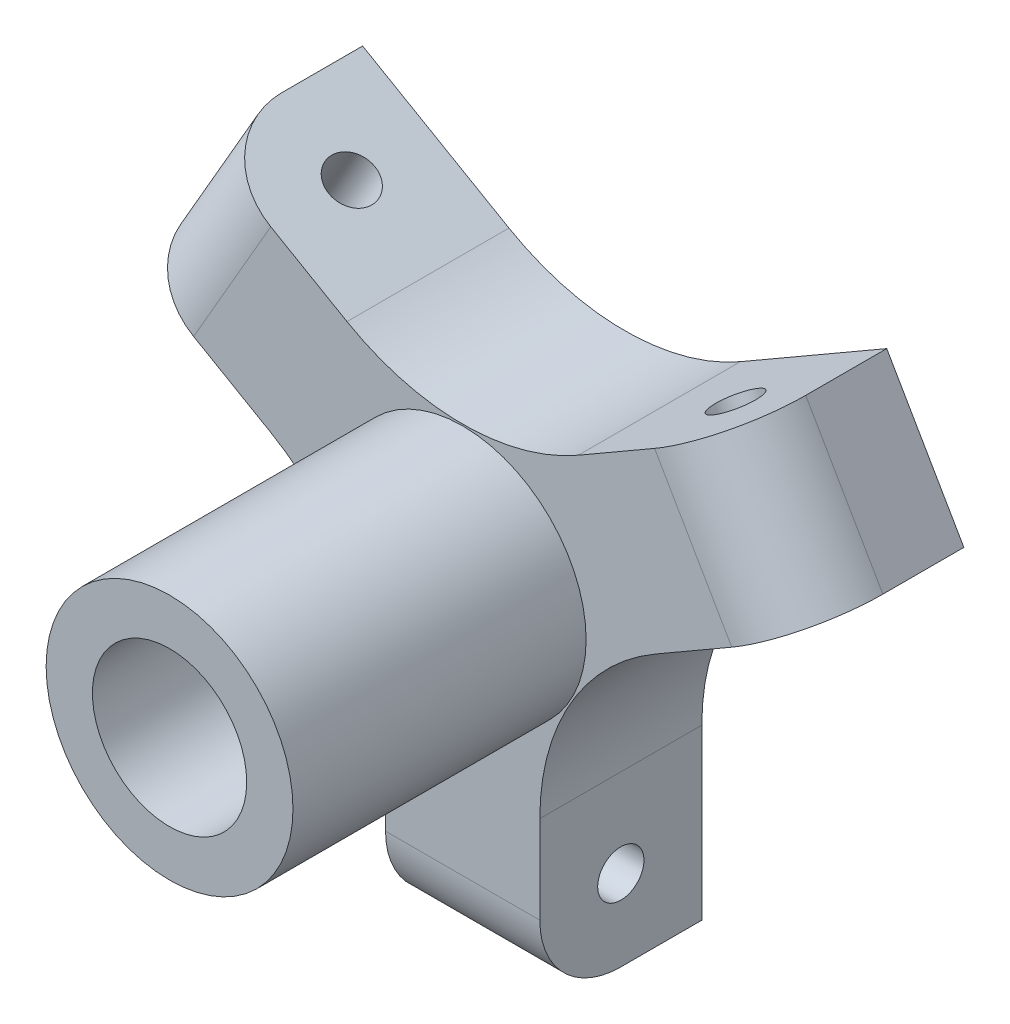
ISO-10303-21;
HEADER;
FILE_DESCRIPTION(('STEP AP214'),'2;1');
FILE_NAME('part.step','',(''),(''),'','','');
FILE_SCHEMA(('AUTOMOTIVE_DESIGN { 1 0 10303 214 1 1 1 1 }'));
ENDSEC;
DATA;
#1=APPLICATION_CONTEXT('core data for automotive mechanical design processes');
#2=APPLICATION_PROTOCOL_DEFINITION('international standard','automotive_design',2000,#1);
#3=PRODUCT_CONTEXT('',#1,'mechanical');
#4=PRODUCT('Part','Part','',(#3));
#5=PRODUCT_RELATED_PRODUCT_CATEGORY('part','',(#4));
#6=PRODUCT_DEFINITION_FORMATION('','',#4);
#7=PRODUCT_DEFINITION_CONTEXT('part definition',#1,'design');
#8=PRODUCT_DEFINITION('design','',#6,#7);
#9=PRODUCT_DEFINITION_SHAPE('','',#8);
#10=(LENGTH_UNIT() NAMED_UNIT(*) SI_UNIT(.MILLI.,.METRE.));
#11=(NAMED_UNIT(*) PLANE_ANGLE_UNIT() SI_UNIT($,.RADIAN.));
#12=(NAMED_UNIT(*) SI_UNIT($,.STERADIAN.) SOLID_ANGLE_UNIT());
#13=UNCERTAINTY_MEASURE_WITH_UNIT(LENGTH_MEASURE(1.E-05),#10,'distance_accuracy_value','');
#14=(GEOMETRIC_REPRESENTATION_CONTEXT(3) GLOBAL_UNCERTAINTY_ASSIGNED_CONTEXT((#13)) GLOBAL_UNIT_ASSIGNED_CONTEXT((#10,
#11,#12)) REPRESENTATION_CONTEXT('',''));
#15=CARTESIAN_POINT('',(0.,0.,0.));
#16=DIRECTION('',(0.,0.,1.));
#17=DIRECTION('',(1.,0.,0.));
#18=AXIS2_PLACEMENT_3D('',#15,#16,#17);
#19=CARTESIAN_POINT('',(40.0000000000001,-23.0940107675849,21.));
#20=DIRECTION('',(0.,0.,-1.));
#21=DIRECTION('',(-1.,0.,0.));
#22=AXIS2_PLACEMENT_3D('',#19,#20,#21);
#23=CYLINDRICAL_SURFACE('',#22,30.);
#24=CARTESIAN_POINT('',(40.0000000000001,-23.0940107675849,0.));
#25=DIRECTION('',(0.,0.,-1.));
#26=DIRECTION('',(-1.,0.,0.));
#27=AXIS2_PLACEMENT_3D('',#24,#25,#26);
#28=CIRCLE('',#27,30.);
#29=CARTESIAN_POINT('',(10.0000000000001,-23.0940107675851,0.));
#30=VERTEX_POINT('',#29);
#31=CARTESIAN_POINT('',(25.0000000000003,2.8867513459483,0.));
#32=VERTEX_POINT('',#31);
#33=EDGE_CURVE('E170',#30,#32,#28,.T.);
#34=ORIENTED_EDGE('',*,*,#33,.T.);
#35=DIRECTION('',(0.,0.,-1.));
#36=VECTOR('',#35,1.);
#37=CARTESIAN_POINT('',(25.0000000000003,2.8867513459483,21.));
#38=LINE('',#37,#36);
#39=CARTESIAN_POINT('',(25.0000000000003,2.8867513459483,21.));
#40=VERTEX_POINT('',#39);
#41=EDGE_CURVE('E149',#40,#32,#38,.T.);
#42=ORIENTED_EDGE('',*,*,#41,.F.);
#43=CARTESIAN_POINT('',(40.0000000000001,-23.0940107675849,21.));
#44=DIRECTION('',(0.,0.,-1.));
#45=DIRECTION('',(-1.,0.,0.));
#46=AXIS2_PLACEMENT_3D('',#43,#44,#45);
#47=CIRCLE('',#46,30.);
#48=CARTESIAN_POINT('',(10.0000000000001,-23.0940107675851,21.));
#49=VERTEX_POINT('',#48);
#50=EDGE_CURVE('E157',#49,#40,#47,.T.);
#51=ORIENTED_EDGE('',*,*,#50,.F.);
#52=DIRECTION('',(0.,0.,-1.));
#53=VECTOR('',#52,1.);
#54=CARTESIAN_POINT('',(10.0000000000001,-23.0940107675851,21.));
#55=LINE('',#54,#53);
#56=EDGE_CURVE('E239',#49,#30,#55,.T.);
#57=ORIENTED_EDGE('',*,*,#56,.T.);
#58=EDGE_LOOP('',(#34,#42,#51,#57));
#59=FACE_BOUND('',#58,.T.);
#60=ADVANCED_FACE('F34',(#59),#23,.F.);
#61=CARTESIAN_POINT('',(43.9711431702997,13.8397459621556,21.));
#62=DIRECTION('',(-0.5,0.866025403784439,0.));
#63=DIRECTION('',(-0.866025403784439,-0.5,0.));
#64=AXIS2_PLACEMENT_3D('',#61,#62,#63);
#65=PLANE('',#64);
#66=CARTESIAN_POINT('',(34.877876430563,8.5897459621558,10.5));
#67=DIRECTION('',(0.500000000000009,-0.866025403784433,0.));
#68=DIRECTION('',(0.866025403784433,0.500000000000009,0.));
#69=AXIS2_PLACEMENT_3D('',#66,#67,#68);
#70=CIRCLE('',#69,3.);
#71=CARTESIAN_POINT('',(37.4759526419163,10.0897459621558,10.5));
#72=VERTEX_POINT('',#71);
#73=EDGE_CURVE('E209',#72,#72,#70,.T.);
#74=ORIENTED_EDGE('',*,*,#73,.F.);
#75=EDGE_LOOP('',(#74));
#76=FACE_BOUND('',#75,.T.);
#77=DIRECTION('',(0.,0.,-1.));
#78=VECTOR('',#77,1.);
#79=CARTESIAN_POINT('',(43.9711431702997,13.8397459621556,21.));
#80=LINE('',#79,#78);
#81=CARTESIAN_POINT('',(43.9711431702997,13.8397459621556,10.5));
#82=VERTEX_POINT('',#81);
#83=CARTESIAN_POINT('',(43.9711431702997,13.8397459621556,0.));
#84=VERTEX_POINT('',#83);
#85=EDGE_CURVE('E172',#82,#84,#80,.T.);
#86=ORIENTED_EDGE('',*,*,#85,.F.);
#87=CARTESIAN_POINT('',(34.8778764305631,8.58974596215562,10.5));
#88=DIRECTION('',(-0.5,0.866025403784439,0.));
#89=DIRECTION('',(-0.866025403784439,-0.5,0.));
#90=AXIS2_PLACEMENT_3D('',#87,#88,#89);
#91=CIRCLE('',#90,10.5);
#92=CARTESIAN_POINT('',(34.8778764305631,8.58974596215563,21.));
#93=VERTEX_POINT('',#92);
#94=EDGE_CURVE('E152',#82,#93,#91,.F.);
#95=ORIENTED_EDGE('',*,*,#94,.T.);
#96=DIRECTION('',(0.866025403784439,0.5,0.));
#97=VECTOR('',#96,1.);
#98=CARTESIAN_POINT('',(43.9711431702997,13.8397459621556,21.));
#99=LINE('',#98,#97);
#100=EDGE_CURVE('E143',#40,#93,#99,.T.);
#101=ORIENTED_EDGE('',*,*,#100,.F.);
#102=ORIENTED_EDGE('',*,*,#41,.T.);
#103=DIRECTION('',(0.866025403784439,0.5,0.));
#104=VECTOR('',#103,1.);
#105=CARTESIAN_POINT('',(43.9711431702997,13.8397459621556,0.));
#106=LINE('',#105,#104);
#107=EDGE_CURVE('E241',#32,#84,#106,.T.);
#108=ORIENTED_EDGE('',*,*,#107,.T.);
#109=EDGE_LOOP('',(#86,#95,#101,#102,#108));
#110=FACE_BOUND('',#109,.T.);
#111=ADVANCED_FACE('F146',(#76,#110),#65,.F.);
#112=CARTESIAN_POINT('',(33.9711431702997,31.1602540378444,21.));
#113=DIRECTION('',(-0.866025403784439,-0.5,0.));
#114=DIRECTION('',(0.5,-0.866025403784439,0.));
#115=AXIS2_PLACEMENT_3D('',#112,#113,#114);
#116=PLANE('',#115);
#117=DIRECTION('',(0.,0.,-1.));
#118=VECTOR('',#117,1.);
#119=CARTESIAN_POINT('',(33.9711431702997,31.1602540378444,21.));
#120=LINE('',#119,#118);
#121=CARTESIAN_POINT('',(33.9711431702997,31.1602540378444,10.5));
#122=VERTEX_POINT('',#121);
#123=CARTESIAN_POINT('',(33.9711431702997,31.1602540378444,0.));
#124=VERTEX_POINT('',#123);
#125=EDGE_CURVE('E176',#122,#124,#120,.T.);
#126=ORIENTED_EDGE('',*,*,#125,.F.);
#127=DIRECTION('',(-0.5,0.866025403784439,0.));
#128=VECTOR('',#127,1.);
#129=CARTESIAN_POINT('',(33.9711431702997,31.1602540378444,10.5));
#130=LINE('',#129,#128);
#131=EDGE_CURVE('E192',#122,#82,#130,.F.);
#132=ORIENTED_EDGE('',*,*,#131,.T.);
#133=ORIENTED_EDGE('',*,*,#85,.T.);
#134=DIRECTION('',(-0.5,0.866025403784439,0.));
#135=VECTOR('',#134,1.);
#136=CARTESIAN_POINT('',(33.9711431702997,31.1602540378444,0.));
#137=LINE('',#136,#135);
#138=EDGE_CURVE('E243',#84,#124,#137,.T.);
#139=ORIENTED_EDGE('',*,*,#138,.T.);
#140=EDGE_LOOP('',(#126,#132,#133,#139));
#141=FACE_BOUND('',#140,.T.);
#142=ADVANCED_FACE('F296',(#141),#116,.F.);
#143=CARTESIAN_POINT('',(15.0000000000002,20.207259421637,21.));
#144=DIRECTION('',(0.5,-0.866025403784439,0.));
#145=DIRECTION('',(0.866025403784439,0.5,0.));
#146=AXIS2_PLACEMENT_3D('',#143,#144,#145);
#147=PLANE('',#146);
#148=CARTESIAN_POINT('',(24.8778764305629,25.9102540378443,10.5));
#149=DIRECTION('',(0.5,-0.866025403784439,0.));
#150=DIRECTION('',(0.866025403784439,0.5,0.));
#151=AXIS2_PLACEMENT_3D('',#148,#149,#150);
#152=CIRCLE('',#151,3.);
#153=CARTESIAN_POINT('',(27.4759526419162,27.4102540378443,10.5));
#154=VERTEX_POINT('',#153);
#155=EDGE_CURVE('E38',#154,#154,#152,.T.);
#156=ORIENTED_EDGE('',*,*,#155,.T.);
#157=EDGE_LOOP('',(#156));
#158=FACE_BOUND('',#157,.T.);
#159=DIRECTION('',(-0.866025403784439,-0.5,0.));
#160=VECTOR('',#159,1.);
#161=CARTESIAN_POINT('',(15.0000000000002,20.207259421637,21.));
#162=LINE('',#161,#160);
#163=CARTESIAN_POINT('',(24.8778764305631,25.9102540378444,21.));
#164=VERTEX_POINT('',#163);
#165=CARTESIAN_POINT('',(15.0000000000002,20.207259421637,21.));
#166=VERTEX_POINT('',#165);
#167=EDGE_CURVE('E156',#164,#166,#162,.T.);
#168=ORIENTED_EDGE('',*,*,#167,.F.);
#169=CARTESIAN_POINT('',(24.8778764305631,25.9102540378444,10.5));
#170=DIRECTION('',(0.5,-0.866025403784439,0.));
#171=DIRECTION('',(0.866025403784439,0.5,0.));
#172=AXIS2_PLACEMENT_3D('',#169,#170,#171);
#173=CIRCLE('',#172,10.5);
#174=EDGE_CURVE('E190',#164,#122,#173,.F.);
#175=ORIENTED_EDGE('',*,*,#174,.T.);
#176=ORIENTED_EDGE('',*,*,#125,.T.);
#177=DIRECTION('',(-0.866025403784439,-0.5,0.));
#178=VECTOR('',#177,1.);
#179=CARTESIAN_POINT('',(15.0000000000002,20.207259421637,0.));
#180=LINE('',#179,#178);
#181=CARTESIAN_POINT('',(15.0000000000002,20.207259421637,0.));
#182=VERTEX_POINT('',#181);
#183=EDGE_CURVE('E246',#124,#182,#180,.T.);
#184=ORIENTED_EDGE('',*,*,#183,.T.);
#185=DIRECTION('',(0.,0.,-1.));
#186=VECTOR('',#185,1.);
#187=CARTESIAN_POINT('',(15.0000000000002,20.207259421637,21.));
#188=LINE('',#187,#186);
#189=EDGE_CURVE('E285',#166,#182,#188,.T.);
#190=ORIENTED_EDGE('',*,*,#189,.F.);
#191=EDGE_LOOP('',(#168,#175,#176,#184,#190));
#192=FACE_BOUND('',#191,.T.);
#193=ADVANCED_FACE('F290',(#158,#192),#147,.F.);
#194=CARTESIAN_POINT('',(0.,46.1880215351701,21.));
#195=DIRECTION('',(0.,0.,-1.));
#196=DIRECTION('',(-1.,0.,0.));
#197=AXIS2_PLACEMENT_3D('',#194,#195,#196);
#198=CYLINDRICAL_SURFACE('',#197,30.);
#199=CARTESIAN_POINT('',(0.,46.1880215351701,0.));
#200=DIRECTION('',(0.,0.,-1.));
#201=DIRECTION('',(-1.,0.,0.));
#202=AXIS2_PLACEMENT_3D('',#199,#200,#201);
#203=CIRCLE('',#202,30.);
#204=CARTESIAN_POINT('',(-15.,20.207259421637,0.));
#205=VERTEX_POINT('',#204);
#206=EDGE_CURVE('E248',#182,#205,#203,.T.);
#207=ORIENTED_EDGE('',*,*,#206,.T.);
#208=DIRECTION('',(0.,0.,-1.));
#209=VECTOR('',#208,1.);
#210=CARTESIAN_POINT('',(-15.,20.207259421637,21.));
#211=LINE('',#210,#209);
#212=CARTESIAN_POINT('',(-15.,20.207259421637,21.));
#213=VERTEX_POINT('',#212);
#214=EDGE_CURVE('E282',#213,#205,#211,.T.);
#215=ORIENTED_EDGE('',*,*,#214,.F.);
#216=CARTESIAN_POINT('',(0.,46.1880215351701,21.));
#217=DIRECTION('',(0.,0.,-1.));
#218=DIRECTION('',(-1.,0.,0.));
#219=AXIS2_PLACEMENT_3D('',#216,#217,#218);
#220=CIRCLE('',#219,30.);
#221=EDGE_CURVE('E227',#166,#213,#220,.T.);
#222=ORIENTED_EDGE('',*,*,#221,.F.);
#223=ORIENTED_EDGE('',*,*,#189,.T.);
#224=EDGE_LOOP('',(#207,#215,#222,#223));
#225=FACE_BOUND('',#224,.T.);
#226=ADVANCED_FACE('F304',(#225),#198,.F.);
#227=CARTESIAN_POINT('',(-33.9711431702996,31.1602540378444,21.));
#228=DIRECTION('',(-0.499999999999999,-0.866025403784439,0.));
#229=DIRECTION('',(0.866025403784439,-0.499999999999999,0.));
#230=AXIS2_PLACEMENT_3D('',#227,#228,#229);
#231=PLANE('',#230);
#232=CARTESIAN_POINT('',(-24.877876430563,25.9102540378444,10.5));
#233=DIRECTION('',(0.499999999999999,0.866025403784439,0.));
#234=DIRECTION('',(-0.866025403784439,0.499999999999999,0.));
#235=AXIS2_PLACEMENT_3D('',#232,#233,#234);
#236=CIRCLE('',#235,3.);
#237=CARTESIAN_POINT('',(-27.4759526419163,27.4102540378444,10.5));
#238=VERTEX_POINT('',#237);
#239=EDGE_CURVE('E201',#238,#238,#236,.T.);
#240=ORIENTED_EDGE('',*,*,#239,.F.);
#241=EDGE_LOOP('',(#240));
#242=FACE_BOUND('',#241,.T.);
#243=DIRECTION('',(0.,0.,-1.));
#244=VECTOR('',#243,1.);
#245=CARTESIAN_POINT('',(-33.9711431702996,31.1602540378444,21.));
#246=LINE('',#245,#244);
#247=CARTESIAN_POINT('',(-33.9711431702996,31.1602540378444,10.5));
#248=VERTEX_POINT('',#247);
#249=CARTESIAN_POINT('',(-33.9711431702996,31.1602540378444,0.));
#250=VERTEX_POINT('',#249);
#251=EDGE_CURVE('E280',#248,#250,#246,.T.);
#252=ORIENTED_EDGE('',*,*,#251,.F.);
#253=CARTESIAN_POINT('',(-24.877876430563,25.9102540378444,10.5));
#254=DIRECTION('',(-0.499999999999999,-0.866025403784439,0.));
#255=DIRECTION('',(0.866025403784439,-0.499999999999999,0.));
#256=AXIS2_PLACEMENT_3D('',#253,#254,#255);
#257=CIRCLE('',#256,10.5);
#258=CARTESIAN_POINT('',(-24.877876430563,25.9102540378444,21.));
#259=VERTEX_POINT('',#258);
#260=EDGE_CURVE('E188',#248,#259,#257,.F.);
#261=ORIENTED_EDGE('',*,*,#260,.T.);
#262=DIRECTION('',(-0.866025403784439,0.499999999999999,0.));
#263=VECTOR('',#262,1.);
#264=CARTESIAN_POINT('',(-33.9711431702996,31.1602540378444,21.));
#265=LINE('',#264,#263);
#266=EDGE_CURVE('E229',#213,#259,#265,.T.);
#267=ORIENTED_EDGE('',*,*,#266,.F.);
#268=ORIENTED_EDGE('',*,*,#214,.T.);
#269=DIRECTION('',(-0.866025403784439,0.499999999999999,0.));
#270=VECTOR('',#269,1.);
#271=CARTESIAN_POINT('',(-33.9711431702996,31.1602540378444,0.));
#272=LINE('',#271,#270);
#273=EDGE_CURVE('E250',#205,#250,#272,.T.);
#274=ORIENTED_EDGE('',*,*,#273,.T.);
#275=EDGE_LOOP('',(#252,#261,#267,#268,#274));
#276=FACE_BOUND('',#275,.T.);
#277=ADVANCED_FACE('F309',(#242,#276),#231,.F.);
#278=CARTESIAN_POINT('',(-43.9711431702995,13.8397459621556,21.));
#279=DIRECTION('',(0.866025403784439,-0.499999999999999,0.));
#280=DIRECTION('',(0.499999999999999,0.866025403784439,0.));
#281=AXIS2_PLACEMENT_3D('',#278,#279,#280);
#282=PLANE('',#281);
#283=DIRECTION('',(0.,0.,-1.));
#284=VECTOR('',#283,1.);
#285=CARTESIAN_POINT('',(-43.9711431702995,13.8397459621556,21.));
#286=LINE('',#285,#284);
#287=CARTESIAN_POINT('',(-43.9711431702995,13.8397459621556,10.5));
#288=VERTEX_POINT('',#287);
#289=CARTESIAN_POINT('',(-43.9711431702995,13.8397459621556,0.));
#290=VERTEX_POINT('',#289);
#291=EDGE_CURVE('E278',#288,#290,#286,.T.);
#292=ORIENTED_EDGE('',*,*,#291,.F.);
#293=DIRECTION('',(-0.499999999999999,-0.866025403784439,0.));
#294=VECTOR('',#293,1.);
#295=CARTESIAN_POINT('',(-43.9711431702995,13.8397459621556,10.5));
#296=LINE('',#295,#294);
#297=EDGE_CURVE('E186',#288,#248,#296,.F.);
#298=ORIENTED_EDGE('',*,*,#297,.T.);
#299=ORIENTED_EDGE('',*,*,#251,.T.);
#300=DIRECTION('',(-0.499999999999999,-0.866025403784439,0.));
#301=VECTOR('',#300,1.);
#302=CARTESIAN_POINT('',(-43.9711431702995,13.8397459621556,0.));
#303=LINE('',#302,#301);
#304=EDGE_CURVE('E253',#250,#290,#303,.T.);
#305=ORIENTED_EDGE('',*,*,#304,.T.);
#306=EDGE_LOOP('',(#292,#298,#299,#305));
#307=FACE_BOUND('',#306,.T.);
#308=ADVANCED_FACE('F321',(#307),#282,.F.);
#309=CARTESIAN_POINT('',(-25.,2.88675134594824,21.));
#310=DIRECTION('',(0.5,0.866025403784439,0.));
#311=DIRECTION('',(-0.866025403784439,0.5,0.));
#312=AXIS2_PLACEMENT_3D('',#309,#310,#311);
#313=PLANE('',#312);
#314=CARTESIAN_POINT('',(-34.8778764305629,8.58974596215559,10.5));
#315=DIRECTION('',(0.5,0.866025403784439,0.));
#316=DIRECTION('',(-0.866025403784439,0.5,0.));
#317=AXIS2_PLACEMENT_3D('',#314,#315,#316);
#318=CIRCLE('',#317,3.);
#319=CARTESIAN_POINT('',(-37.4759526419163,10.0897459621556,10.5));
#320=VERTEX_POINT('',#319);
#321=EDGE_CURVE('E198',#320,#320,#318,.T.);
#322=ORIENTED_EDGE('',*,*,#321,.T.);
#323=EDGE_LOOP('',(#322));
#324=FACE_BOUND('',#323,.T.);
#325=DIRECTION('',(0.866025403784439,-0.5,0.));
#326=VECTOR('',#325,1.);
#327=CARTESIAN_POINT('',(-25.,2.88675134594824,21.));
#328=LINE('',#327,#326);
#329=CARTESIAN_POINT('',(-34.8778764305629,8.58974596215559,21.));
#330=VERTEX_POINT('',#329);
#331=CARTESIAN_POINT('',(-25.,2.88675134594825,21.));
#332=VERTEX_POINT('',#331);
#333=EDGE_CURVE('E231',#330,#332,#328,.T.);
#334=ORIENTED_EDGE('',*,*,#333,.F.);
#335=CARTESIAN_POINT('',(-34.8778764305629,8.58974596215559,10.5));
#336=DIRECTION('',(0.5,0.866025403784439,0.));
#337=DIRECTION('',(-0.866025403784439,0.5,0.));
#338=AXIS2_PLACEMENT_3D('',#335,#336,#337);
#339=CIRCLE('',#338,10.5);
#340=EDGE_CURVE('E184',#330,#288,#339,.F.);
#341=ORIENTED_EDGE('',*,*,#340,.T.);
#342=ORIENTED_EDGE('',*,*,#291,.T.);
#343=DIRECTION('',(0.866025403784439,-0.5,0.));
#344=VECTOR('',#343,1.);
#345=CARTESIAN_POINT('',(-25.,2.88675134594824,0.));
#346=LINE('',#345,#344);
#347=CARTESIAN_POINT('',(-25.,2.88675134594825,0.));
#348=VERTEX_POINT('',#347);
#349=EDGE_CURVE('E256',#290,#348,#346,.T.);
#350=ORIENTED_EDGE('',*,*,#349,.T.);
#351=DIRECTION('',(0.,0.,-1.));
#352=VECTOR('',#351,1.);
#353=CARTESIAN_POINT('',(-25.,2.88675134594825,21.));
#354=LINE('',#353,#352);
#355=EDGE_CURVE('E275',#332,#348,#354,.T.);
#356=ORIENTED_EDGE('',*,*,#355,.F.);
#357=EDGE_LOOP('',(#334,#341,#342,#350,#356));
#358=FACE_BOUND('',#357,.T.);
#359=ADVANCED_FACE('F318',(#324,#358),#313,.F.);
#360=CARTESIAN_POINT('',(-39.9999999999999,-23.094010767585,21.));
#361=DIRECTION('',(0.,0.,-1.));
#362=DIRECTION('',(-1.,0.,0.));
#363=AXIS2_PLACEMENT_3D('',#360,#361,#362);
#364=CYLINDRICAL_SURFACE('',#363,30.);
#365=CARTESIAN_POINT('',(-39.9999999999999,-23.094010767585,0.));
#366=DIRECTION('',(0.,0.,-1.));
#367=DIRECTION('',(1.,0.,0.));
#368=AXIS2_PLACEMENT_3D('',#365,#366,#367);
#369=CIRCLE('',#368,30.);
#370=CARTESIAN_POINT('',(-9.99999999999989,-23.0940107675851,0.));
#371=VERTEX_POINT('',#370);
#372=EDGE_CURVE('E258',#348,#371,#369,.T.);
#373=ORIENTED_EDGE('',*,*,#372,.T.);
#374=DIRECTION('',(0.,0.,-1.));
#375=VECTOR('',#374,1.);
#376=CARTESIAN_POINT('',(-9.99999999999989,-23.0940107675851,21.));
#377=LINE('',#376,#375);
#378=CARTESIAN_POINT('',(-9.99999999999989,-23.0940107675851,21.));
#379=VERTEX_POINT('',#378);
#380=EDGE_CURVE('E272',#379,#371,#377,.T.);
#381=ORIENTED_EDGE('',*,*,#380,.F.);
#382=CARTESIAN_POINT('',(-39.9999999999999,-23.094010767585,21.));
#383=DIRECTION('',(0.,0.,-1.));
#384=DIRECTION('',(1.,0.,0.));
#385=AXIS2_PLACEMENT_3D('',#382,#383,#384);
#386=CIRCLE('',#385,30.);
#387=EDGE_CURVE('E233',#332,#379,#386,.T.);
#388=ORIENTED_EDGE('',*,*,#387,.F.);
#389=ORIENTED_EDGE('',*,*,#355,.T.);
#390=EDGE_LOOP('',(#373,#381,#388,#389));
#391=FACE_BOUND('',#390,.T.);
#392=ADVANCED_FACE('F327',(#391),#364,.F.);
#393=CARTESIAN_POINT('',(-9.99999999999988,-44.9999999999998,21.));
#394=DIRECTION('',(1.,0.,0.));
#395=DIRECTION('',(0.,1.,0.));
#396=AXIS2_PLACEMENT_3D('',#393,#394,#395);
#397=PLANE('',#396);
#398=CARTESIAN_POINT('',(-9.99999999999991,-34.4999999999999,10.5));
#399=DIRECTION('',(-1.,0.,0.));
#400=DIRECTION('',(0.,-1.,0.));
#401=AXIS2_PLACEMENT_3D('',#398,#399,#400);
#402=CIRCLE('',#401,3.);
#403=CARTESIAN_POINT('',(-9.99999999999989,-37.4999999999999,10.5));
#404=VERTEX_POINT('',#403);
#405=EDGE_CURVE('E204',#404,#404,#402,.T.);
#406=ORIENTED_EDGE('',*,*,#405,.F.);
#407=EDGE_LOOP('',(#406));
#408=FACE_BOUND('',#407,.T.);
#409=DIRECTION('',(0.,0.,-1.));
#410=VECTOR('',#409,1.);
#411=CARTESIAN_POINT('',(-9.99999999999988,-44.9999999999998,21.));
#412=LINE('',#411,#410);
#413=CARTESIAN_POINT('',(-9.99999999999988,-44.9999999999998,10.5));
#414=VERTEX_POINT('',#413);
#415=CARTESIAN_POINT('',(-9.99999999999988,-44.9999999999998,0.));
#416=VERTEX_POINT('',#415);
#417=EDGE_CURVE('E270',#414,#416,#412,.T.);
#418=ORIENTED_EDGE('',*,*,#417,.F.);
#419=CARTESIAN_POINT('',(-9.99999999999988,-34.4999999999998,10.5));
#420=DIRECTION('',(1.,0.,0.));
#421=DIRECTION('',(0.,1.,0.));
#422=AXIS2_PLACEMENT_3D('',#419,#420,#421);
#423=CIRCLE('',#422,10.5);
#424=CARTESIAN_POINT('',(-9.99999999999988,-34.4999999999999,21.));
#425=VERTEX_POINT('',#424);
#426=EDGE_CURVE('E43',#414,#425,#423,.F.);
#427=ORIENTED_EDGE('',*,*,#426,.T.);
#428=DIRECTION('',(0.,-1.,0.));
#429=VECTOR('',#428,1.);
#430=CARTESIAN_POINT('',(-9.99999999999988,-44.9999999999998,21.));
#431=LINE('',#430,#429);
#432=EDGE_CURVE('E235',#379,#425,#431,.T.);
#433=ORIENTED_EDGE('',*,*,#432,.F.);
#434=ORIENTED_EDGE('',*,*,#380,.T.);
#435=DIRECTION('',(0.,-1.,0.));
#436=VECTOR('',#435,1.);
#437=CARTESIAN_POINT('',(-9.99999999999988,-44.9999999999998,0.));
#438=LINE('',#437,#436);
#439=EDGE_CURVE('E260',#371,#416,#438,.T.);
#440=ORIENTED_EDGE('',*,*,#439,.T.);
#441=EDGE_LOOP('',(#418,#427,#433,#434,#440));
#442=FACE_BOUND('',#441,.T.);
#443=ADVANCED_FACE('F334',(#408,#442),#397,.F.);
#444=CARTESIAN_POINT('',(10.0000000000001,-44.9999999999998,21.));
#445=DIRECTION('',(0.,1.,0.));
#446=DIRECTION('',(-1.,0.,0.));
#447=AXIS2_PLACEMENT_3D('',#444,#445,#446);
#448=PLANE('',#447);
#449=DIRECTION('',(0.,0.,-1.));
#450=VECTOR('',#449,1.);
#451=CARTESIAN_POINT('',(10.0000000000001,-44.9999999999998,21.));
#452=LINE('',#451,#450);
#453=CARTESIAN_POINT('',(10.0000000000001,-44.9999999999998,10.5));
#454=VERTEX_POINT('',#453);
#455=CARTESIAN_POINT('',(10.0000000000001,-44.9999999999998,0.));
#456=VERTEX_POINT('',#455);
#457=EDGE_CURVE('E268',#454,#456,#452,.T.);
#458=ORIENTED_EDGE('',*,*,#457,.F.);
#459=DIRECTION('',(1.,0.,0.));
#460=VECTOR('',#459,1.);
#461=CARTESIAN_POINT('',(10.0000000000001,-44.9999999999998,10.5));
#462=LINE('',#461,#460);
#463=EDGE_CURVE('E51',#454,#414,#462,.F.);
#464=ORIENTED_EDGE('',*,*,#463,.T.);
#465=ORIENTED_EDGE('',*,*,#417,.T.);
#466=DIRECTION('',(1.,0.,0.));
#467=VECTOR('',#466,1.);
#468=CARTESIAN_POINT('',(10.0000000000001,-44.9999999999998,0.));
#469=LINE('',#468,#467);
#470=EDGE_CURVE('E263',#416,#456,#469,.T.);
#471=ORIENTED_EDGE('',*,*,#470,.T.);
#472=EDGE_LOOP('',(#458,#464,#465,#471));
#473=FACE_BOUND('',#472,.T.);
#474=ADVANCED_FACE('F336',(#473),#448,.F.);
#475=CARTESIAN_POINT('',(10.0000000000001,-23.0940107675851,21.));
#476=DIRECTION('',(-1.,0.,0.));
#477=DIRECTION('',(0.,-1.,0.));
#478=AXIS2_PLACEMENT_3D('',#475,#476,#477);
#479=PLANE('',#478);
#480=CARTESIAN_POINT('',(10.0000000000001,-34.4999999999998,10.5));
#481=DIRECTION('',(-1.,0.,0.));
#482=DIRECTION('',(0.,-1.,0.));
#483=AXIS2_PLACEMENT_3D('',#480,#481,#482);
#484=CIRCLE('',#483,3.);
#485=CARTESIAN_POINT('',(10.0000000000001,-37.4999999999998,10.5));
#486=VERTEX_POINT('',#485);
#487=EDGE_CURVE('E202',#486,#486,#484,.T.);
#488=ORIENTED_EDGE('',*,*,#487,.T.);
#489=EDGE_LOOP('',(#488));
#490=FACE_BOUND('',#489,.T.);
#491=DIRECTION('',(0.,1.,0.));
#492=VECTOR('',#491,1.);
#493=CARTESIAN_POINT('',(10.0000000000001,-23.0940107675851,21.));
#494=LINE('',#493,#492);
#495=CARTESIAN_POINT('',(10.0000000000001,-34.4999999999998,21.));
#496=VERTEX_POINT('',#495);
#497=EDGE_CURVE('E163',#496,#49,#494,.T.);
#498=ORIENTED_EDGE('',*,*,#497,.F.);
#499=CARTESIAN_POINT('',(10.0000000000001,-34.4999999999998,10.5));
#500=DIRECTION('',(-1.,0.,0.));
#501=DIRECTION('',(0.,-1.,0.));
#502=AXIS2_PLACEMENT_3D('',#499,#500,#501);
#503=CIRCLE('',#502,10.5);
#504=EDGE_CURVE('E59',#496,#454,#503,.F.);
#505=ORIENTED_EDGE('',*,*,#504,.T.);
#506=ORIENTED_EDGE('',*,*,#457,.T.);
#507=DIRECTION('',(0.,1.,0.));
#508=VECTOR('',#507,1.);
#509=CARTESIAN_POINT('',(10.0000000000001,-23.0940107675851,0.));
#510=LINE('',#509,#508);
#511=EDGE_CURVE('E167',#456,#30,#510,.T.);
#512=ORIENTED_EDGE('',*,*,#511,.T.);
#513=ORIENTED_EDGE('',*,*,#56,.F.);
#514=EDGE_LOOP('',(#498,#505,#506,#512,#513));
#515=FACE_BOUND('',#514,.T.);
#516=ADVANCED_FACE('F338',(#490,#515),#479,.F.);
#517=CARTESIAN_POINT('',(40.0000000000001,-23.0940107675849,21.));
#518=DIRECTION('',(0.,0.,-1.));
#519=DIRECTION('',(-1.,0.,0.));
#520=AXIS2_PLACEMENT_3D('',#517,#518,#519);
#521=PLANE('',#520);
#522=CARTESIAN_POINT('',(0.,0.,21.));
#523=DIRECTION('',(0.,0.,-1.));
#524=DIRECTION('',(-1.,0.,0.));
#525=AXIS2_PLACEMENT_3D('',#522,#523,#524);
#526=CIRCLE('',#525,16.);
#527=CARTESIAN_POINT('',(-16.,0.,21.));
#528=VERTEX_POINT('',#527);
#529=EDGE_CURVE('E11',#528,#528,#526,.F.);
#530=ORIENTED_EDGE('',*,*,#529,.F.);
#531=EDGE_LOOP('',(#530));
#532=FACE_BOUND('',#531,.T.);
#533=ORIENTED_EDGE('',*,*,#266,.T.);
#534=DIRECTION('',(-0.499999999999999,-0.866025403784439,0.));
#535=VECTOR('',#534,1.);
#536=CARTESIAN_POINT('',(-29.877876430563,17.25,21.));
#537=LINE('',#536,#535);
#538=EDGE_CURVE('E181',#259,#330,#537,.T.);
#539=ORIENTED_EDGE('',*,*,#538,.T.);
#540=ORIENTED_EDGE('',*,*,#333,.T.);
#541=ORIENTED_EDGE('',*,*,#387,.T.);
#542=ORIENTED_EDGE('',*,*,#432,.T.);
#543=DIRECTION('',(1.,0.,0.));
#544=VECTOR('',#543,1.);
#545=CARTESIAN_POINT('',(40.0000000000001,-34.4999999999998,21.));
#546=LINE('',#545,#544);
#547=EDGE_CURVE('E171',#425,#496,#546,.T.);
#548=ORIENTED_EDGE('',*,*,#547,.T.);
#549=ORIENTED_EDGE('',*,*,#497,.T.);
#550=ORIENTED_EDGE('',*,*,#50,.T.);
#551=ORIENTED_EDGE('',*,*,#100,.T.);
#552=DIRECTION('',(-0.5,0.866025403784439,0.));
#553=VECTOR('',#552,1.);
#554=CARTESIAN_POINT('',(49.8778764305631,-17.3910161513775,21.));
#555=LINE('',#554,#553);
#556=EDGE_CURVE('E174',#93,#164,#555,.T.);
#557=ORIENTED_EDGE('',*,*,#556,.T.);
#558=ORIENTED_EDGE('',*,*,#167,.T.);
#559=ORIENTED_EDGE('',*,*,#221,.T.);
#560=EDGE_LOOP('',(#533,#539,#540,#541,#542,#548,#549,#550,#551,#557,#558,#559));
#561=FACE_BOUND('',#560,.T.);
#562=ADVANCED_FACE('F161',(#532,#561),#521,.F.);
#563=CARTESIAN_POINT('',(40.0000000000001,-23.0940107675849,0.));
#564=DIRECTION('',(0.,0.,-1.));
#565=DIRECTION('',(-1.,0.,0.));
#566=AXIS2_PLACEMENT_3D('',#563,#564,#565);
#567=PLANE('',#566);
#568=CARTESIAN_POINT('',(0.,0.,0.));
#569=DIRECTION('',(0.,0.,-1.));
#570=DIRECTION('',(-1.,0.,0.));
#571=AXIS2_PLACEMENT_3D('',#568,#569,#570);
#572=CIRCLE('',#571,10.);
#573=CARTESIAN_POINT('',(-10.,0.,0.));
#574=VERTEX_POINT('',#573);
#575=EDGE_CURVE('E220',#574,#574,#572,.T.);
#576=ORIENTED_EDGE('',*,*,#575,.F.);
#577=EDGE_LOOP('',(#576));
#578=FACE_BOUND('',#577,.T.);
#579=ORIENTED_EDGE('',*,*,#33,.F.);
#580=ORIENTED_EDGE('',*,*,#511,.F.);
#581=ORIENTED_EDGE('',*,*,#470,.F.);
#582=ORIENTED_EDGE('',*,*,#439,.F.);
#583=ORIENTED_EDGE('',*,*,#372,.F.);
#584=ORIENTED_EDGE('',*,*,#349,.F.);
#585=ORIENTED_EDGE('',*,*,#304,.F.);
#586=ORIENTED_EDGE('',*,*,#273,.F.);
#587=ORIENTED_EDGE('',*,*,#206,.F.);
#588=ORIENTED_EDGE('',*,*,#183,.F.);
#589=ORIENTED_EDGE('',*,*,#138,.F.);
#590=ORIENTED_EDGE('',*,*,#107,.F.);
#591=EDGE_LOOP('',(#579,#580,#581,#582,#583,#584,#585,#586,#587,#588,#589,#590));
#592=FACE_BOUND('',#591,.T.);
#593=ADVANCED_FACE('F299',(#578,#592),#567,.T.);
#594=CARTESIAN_POINT('',(-29.877876430563,17.25,10.5));
#595=DIRECTION('',(-0.499999999999999,-0.866025403784439,0.));
#596=DIRECTION('',(0.866025403784439,-0.499999999999999,0.));
#597=AXIS2_PLACEMENT_3D('',#594,#595,#596);
#598=CYLINDRICAL_SURFACE('',#597,10.5);
#599=ORIENTED_EDGE('',*,*,#260,.F.);
#600=ORIENTED_EDGE('',*,*,#297,.F.);
#601=ORIENTED_EDGE('',*,*,#340,.F.);
#602=ORIENTED_EDGE('',*,*,#538,.F.);
#603=EDGE_LOOP('',(#599,#600,#601,#602));
#604=FACE_BOUND('',#603,.T.);
#605=ADVANCED_FACE('F314',(#604),#598,.T.);
#606=CARTESIAN_POINT('',(49.8778764305631,-17.3910161513775,10.5));
#607=DIRECTION('',(-0.5,0.866025403784439,0.));
#608=DIRECTION('',(-0.866025403784439,-0.5,0.));
#609=AXIS2_PLACEMENT_3D('',#606,#607,#608);
#610=CYLINDRICAL_SURFACE('',#609,10.5);
#611=ORIENTED_EDGE('',*,*,#94,.F.);
#612=ORIENTED_EDGE('',*,*,#131,.F.);
#613=ORIENTED_EDGE('',*,*,#174,.F.);
#614=ORIENTED_EDGE('',*,*,#556,.F.);
#615=EDGE_LOOP('',(#611,#612,#613,#614));
#616=FACE_BOUND('',#615,.T.);
#617=ADVANCED_FACE('F359',(#616),#610,.T.);
#618=CARTESIAN_POINT('',(40.0000000000001,-34.4999999999998,10.5));
#619=DIRECTION('',(1.,0.,0.));
#620=DIRECTION('',(0.,1.,0.));
#621=AXIS2_PLACEMENT_3D('',#618,#619,#620);
#622=CYLINDRICAL_SURFACE('',#621,10.5);
#623=ORIENTED_EDGE('',*,*,#426,.F.);
#624=ORIENTED_EDGE('',*,*,#463,.F.);
#625=ORIENTED_EDGE('',*,*,#504,.F.);
#626=ORIENTED_EDGE('',*,*,#547,.F.);
#627=EDGE_LOOP('',(#623,#624,#625,#626));
#628=FACE_BOUND('',#627,.T.);
#629=ADVANCED_FACE('F36',(#628),#622,.T.);
#630=CARTESIAN_POINT('',(0.,0.,59.));
#631=DIRECTION('',(0.,0.,-1.));
#632=DIRECTION('',(-1.,0.,0.));
#633=AXIS2_PLACEMENT_3D('',#630,#631,#632);
#634=CYLINDRICAL_SURFACE('',#633,16.);
#635=CARTESIAN_POINT('',(0.,0.,59.));
#636=DIRECTION('',(0.,0.,1.));
#637=DIRECTION('',(1.,0.,0.));
#638=AXIS2_PLACEMENT_3D('',#635,#636,#637);
#639=CIRCLE('',#638,16.);
#640=CARTESIAN_POINT('',(16.,0.,59.));
#641=VERTEX_POINT('',#640);
#642=EDGE_CURVE('E223',#641,#641,#639,.T.);
#643=ORIENTED_EDGE('',*,*,#642,.F.);
#644=EDGE_LOOP('',(#643));
#645=FACE_BOUND('',#644,.T.);
#646=ORIENTED_EDGE('',*,*,#529,.T.);
#647=EDGE_LOOP('',(#646));
#648=FACE_BOUND('',#647,.T.);
#649=ADVANCED_FACE('F365',(#645,#648),#634,.T.);
#650=CARTESIAN_POINT('',(0.,0.,59.));
#651=DIRECTION('',(0.,0.,1.));
#652=DIRECTION('',(1.,0.,0.));
#653=AXIS2_PLACEMENT_3D('',#650,#651,#652);
#654=PLANE('',#653);
#655=CARTESIAN_POINT('',(0.,0.,59.));
#656=DIRECTION('',(0.,0.,1.));
#657=DIRECTION('',(1.,0.,0.));
#658=AXIS2_PLACEMENT_3D('',#655,#656,#657);
#659=CIRCLE('',#658,10.);
#660=CARTESIAN_POINT('',(10.,0.,59.));
#661=VERTEX_POINT('',#660);
#662=EDGE_CURVE('E200',#661,#661,#659,.T.);
#663=ORIENTED_EDGE('',*,*,#662,.F.);
#664=EDGE_LOOP('',(#663));
#665=FACE_BOUND('',#664,.T.);
#666=ORIENTED_EDGE('',*,*,#642,.T.);
#667=EDGE_LOOP('',(#666));
#668=FACE_BOUND('',#667,.T.);
#669=ADVANCED_FACE('F369',(#665,#668),#654,.T.);
#670=CARTESIAN_POINT('',(0.,0.,-15.));
#671=DIRECTION('',(0.,0.,1.));
#672=DIRECTION('',(1.,0.,0.));
#673=AXIS2_PLACEMENT_3D('',#670,#671,#672);
#674=CYLINDRICAL_SURFACE('',#673,10.);
#675=ORIENTED_EDGE('',*,*,#575,.T.);
#676=EDGE_LOOP('',(#675));
#677=FACE_BOUND('',#676,.T.);
#678=ORIENTED_EDGE('',*,*,#662,.T.);
#679=EDGE_LOOP('',(#678));
#680=FACE_BOUND('',#679,.T.);
#681=ADVANCED_FACE('F375',(#677,#680),#674,.F.);
#682=CARTESIAN_POINT('',(-37.3778764305629,4.25961894323341,10.5));
#683=DIRECTION('',(0.499999999999999,0.866025403784439,0.));
#684=DIRECTION('',(-0.866025403784439,0.499999999999999,0.));
#685=AXIS2_PLACEMENT_3D('',#682,#683,#684);
#686=CYLINDRICAL_SURFACE('',#685,3.);
#687=ORIENTED_EDGE('',*,*,#239,.T.);
#688=EDGE_LOOP('',(#687));
#689=FACE_BOUND('',#688,.T.);
#690=ORIENTED_EDGE('',*,*,#321,.F.);
#691=EDGE_LOOP('',(#690));
#692=FACE_BOUND('',#691,.T.);
#693=ADVANCED_FACE('F389',(#689,#692),#686,.F.);
#694=CARTESIAN_POINT('',(15.0000000000001,-34.4999999999998,10.5));
#695=DIRECTION('',(-1.,0.,0.));
#696=DIRECTION('',(0.,-1.,0.));
#697=AXIS2_PLACEMENT_3D('',#694,#695,#696);
#698=CYLINDRICAL_SURFACE('',#697,3.);
#699=CARTESIAN_POINT('',(-9.99999999999989,-37.4999999999999,10.5));
#700=CARTESIAN_POINT('',(-9.79166666666655,-37.4999999999999,10.5));
#701=CARTESIAN_POINT('',(-9.58333333333322,-37.4999999999999,10.5));
#702=CARTESIAN_POINT('',(-9.16666666666655,-37.4999999999999,10.5));
#703=CARTESIAN_POINT('',(-8.95833333333322,-37.4999999999999,10.5));
#704=CARTESIAN_POINT('',(-8.54166666666655,-37.4999999999999,10.5));
#705=CARTESIAN_POINT('',(-8.33333333333322,-37.4999999999999,10.5));
#706=CARTESIAN_POINT('',(-7.91666666666655,-37.4999999999999,10.5));
#707=CARTESIAN_POINT('',(-7.70833333333322,-37.4999999999999,10.5));
#708=CARTESIAN_POINT('',(-7.29166666666655,-37.4999999999999,10.5));
#709=CARTESIAN_POINT('',(-7.08333333333322,-37.4999999999999,10.5));
#710=CARTESIAN_POINT('',(-6.66666666666655,-37.4999999999999,10.5));
#711=CARTESIAN_POINT('',(-6.45833333333322,-37.4999999999999,10.5));
#712=CARTESIAN_POINT('',(-6.04166666666655,-37.4999999999999,10.5));
#713=CARTESIAN_POINT('',(-5.83333333333322,-37.4999999999999,10.5));
#714=CARTESIAN_POINT('',(-5.41666666666655,-37.4999999999999,10.5));
#715=CARTESIAN_POINT('',(-5.20833333333322,-37.4999999999999,10.5));
#716=CARTESIAN_POINT('',(-4.79166666666655,-37.4999999999999,10.5));
#717=CARTESIAN_POINT('',(-4.58333333333322,-37.4999999999999,10.5));
#718=CARTESIAN_POINT('',(-4.16666666666655,-37.4999999999999,10.5));
#719=CARTESIAN_POINT('',(-3.95833333333322,-37.4999999999999,10.5));
#720=CARTESIAN_POINT('',(-3.54166666666655,-37.4999999999999,10.5));
#721=CARTESIAN_POINT('',(-3.33333333333322,-37.4999999999999,10.5));
#722=CARTESIAN_POINT('',(-2.91666666666655,-37.4999999999999,10.5));
#723=CARTESIAN_POINT('',(-2.70833333333322,-37.4999999999999,10.5));
#724=CARTESIAN_POINT('',(-2.29166666666655,-37.4999999999999,10.5));
#725=CARTESIAN_POINT('',(-2.08333333333322,-37.4999999999998,10.5));
#726=CARTESIAN_POINT('',(-1.66666666666655,-37.4999999999998,10.5));
#727=CARTESIAN_POINT('',(-1.45833333333322,-37.4999999999998,10.5));
#728=CARTESIAN_POINT('',(-1.04166666666655,-37.4999999999998,10.5));
#729=CARTESIAN_POINT('',(-0.833333333333217,-37.4999999999998,10.5));
#730=CARTESIAN_POINT('',(-0.416666666666551,-37.4999999999998,10.5));
#731=CARTESIAN_POINT('',(-0.208333333333217,-37.4999999999998,10.5));
#732=CARTESIAN_POINT('',(0.20833333333345,-37.4999999999998,10.5));
#733=CARTESIAN_POINT('',(0.416666666666783,-37.4999999999998,10.5));
#734=CARTESIAN_POINT('',(0.83333333333345,-37.4999999999998,10.5));
#735=CARTESIAN_POINT('',(1.04166666666678,-37.4999999999998,10.5));
#736=CARTESIAN_POINT('',(1.45833333333345,-37.4999999999998,10.5));
#737=CARTESIAN_POINT('',(1.66666666666678,-37.4999999999998,10.5));
#738=CARTESIAN_POINT('',(2.08333333333345,-37.4999999999998,10.5));
#739=CARTESIAN_POINT('',(2.29166666666679,-37.4999999999998,10.5));
#740=CARTESIAN_POINT('',(2.70833333333345,-37.4999999999998,10.5));
#741=CARTESIAN_POINT('',(2.91666666666678,-37.4999999999998,10.5));
#742=CARTESIAN_POINT('',(3.33333333333345,-37.4999999999998,10.5));
#743=CARTESIAN_POINT('',(3.54166666666678,-37.4999999999998,10.5));
#744=CARTESIAN_POINT('',(3.95833333333345,-37.4999999999998,10.5));
#745=CARTESIAN_POINT('',(4.16666666666678,-37.4999999999998,10.5));
#746=CARTESIAN_POINT('',(4.58333333333345,-37.4999999999998,10.5));
#747=CARTESIAN_POINT('',(4.79166666666679,-37.4999999999998,10.5));
#748=CARTESIAN_POINT('',(5.20833333333345,-37.4999999999998,10.5));
#749=CARTESIAN_POINT('',(5.41666666666679,-37.4999999999998,10.5));
#750=CARTESIAN_POINT('',(5.83333333333345,-37.4999999999998,10.5));
#751=CARTESIAN_POINT('',(6.04166666666678,-37.4999999999998,10.5));
#752=CARTESIAN_POINT('',(6.45833333333345,-37.4999999999998,10.5));
#753=CARTESIAN_POINT('',(6.66666666666679,-37.4999999999998,10.5));
#754=CARTESIAN_POINT('',(7.08333333333345,-37.4999999999998,10.5));
#755=CARTESIAN_POINT('',(7.29166666666679,-37.4999999999998,10.5));
#756=CARTESIAN_POINT('',(7.70833333333345,-37.4999999999998,10.5));
#757=CARTESIAN_POINT('',(7.91666666666679,-37.4999999999998,10.5));
#758=CARTESIAN_POINT('',(8.33333333333345,-37.4999999999998,10.5));
#759=CARTESIAN_POINT('',(8.54166666666679,-37.4999999999998,10.5));
#760=CARTESIAN_POINT('',(8.95833333333345,-37.4999999999998,10.5));
#761=CARTESIAN_POINT('',(9.16666666666679,-37.4999999999998,10.5));
#762=CARTESIAN_POINT('',(9.58333333333345,-37.4999999999998,10.5));
#763=CARTESIAN_POINT('',(9.79166666666679,-37.4999999999998,10.5));
#764=CARTESIAN_POINT('',(10.0000000000001,-37.4999999999998,10.5));
#765=B_SPLINE_CURVE_WITH_KNOTS('',3,(#699,#700,#701,#702,#703,#704,#705,#706,#707,#708,#709,
#710,#711,#712,#713,#714,#715,#716,#717,#718,#719,#720,#721,#722,#723,#724,#725,#726,#727,#728,
#729,#730,#731,#732,#733,#734,#735,#736,#737,#738,#739,#740,#741,#742,#743,#744,#745,#746,#747,
#748,#749,#750,#751,#752,#753,#754,#755,#756,#757,#758,#759,#760,#761,#762,#763,#764),
.UNSPECIFIED.,.F.,.F.,(4,2,2,2,2,2,2,2,2,2,2,2,2,2,2,2,2,2,2,2,2,2,2,2,2,2,2,2,2,2,2,2,4),(0.,
0.625000000000001,1.25,1.875,2.5,3.125,3.75,4.375,5.,5.62500000000001,6.25000000000001,6.875,
7.5,8.125,8.75,9.375,10.,10.625,11.25,11.875,12.5,13.125,13.75,14.375,15.,15.625,16.25,16.875,
17.5,18.125,18.75,19.375,20.),.UNSPECIFIED.);
#766=EDGE_CURVE('BSEAM395',#404,#486,#765,.T.);
#767=ORIENTED_EDGE('',*,*,#405,.T.);
#768=ORIENTED_EDGE('',*,*,#487,.F.);
#769=ORIENTED_EDGE('',*,*,#766,.T.);
#770=ORIENTED_EDGE('',*,*,#766,.F.);
#771=EDGE_LOOP('',(#767,#769,#768,#770));
#772=FACE_BOUND('',#771,.T.);
#773=ADVANCED_FACE('F395',(#772),#698,.F.);
#774=CARTESIAN_POINT('',(22.3778764305627,30.2403810567666,10.5));
#775=DIRECTION('',(0.500000000000009,-0.866025403784434,0.));
#776=DIRECTION('',(0.866025403784434,0.500000000000009,0.));
#777=AXIS2_PLACEMENT_3D('',#774,#775,#776);
#778=CYLINDRICAL_SURFACE('',#777,3.);
#779=ORIENTED_EDGE('',*,*,#73,.T.);
#780=EDGE_LOOP('',(#779));
#781=FACE_BOUND('',#780,.T.);
#782=ORIENTED_EDGE('',*,*,#155,.F.);
#783=EDGE_LOOP('',(#782));
#784=FACE_BOUND('',#783,.T.);
#785=ADVANCED_FACE('F399',(#781,#784),#778,.F.);
#786=CLOSED_SHELL('',(#60,#111,#142,#193,#226,#277,#308,#359,#392,#443,#474,#516,#562,#593,#605,
#617,#629,#649,#669,#681,#693,#773,#785));
#787=MANIFOLD_SOLID_BREP('B2',#786);
#788=ADVANCED_BREP_SHAPE_REPRESENTATION('',(#18,#787),#14);
#789=SHAPE_DEFINITION_REPRESENTATION(#9,#788);
ENDSEC;
END-ISO-10303-21;
